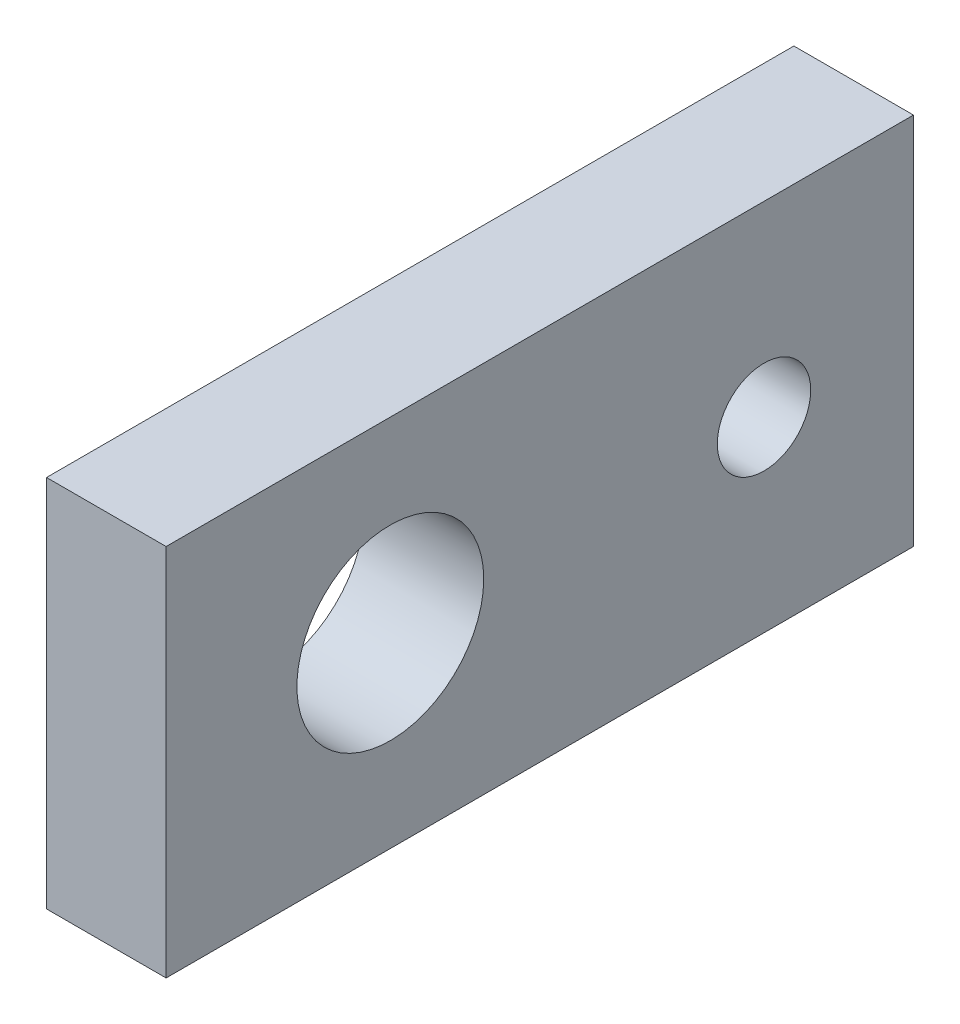
ISO-10303-21;
HEADER;
FILE_DESCRIPTION(('STEP AP214'),'2;1');
FILE_NAME('part.step','',(''),(''),'','','');
FILE_SCHEMA(('AUTOMOTIVE_DESIGN { 1 0 10303 214 1 1 1 1 }'));
ENDSEC;
DATA;
#1=APPLICATION_CONTEXT('core data for automotive mechanical design processes');
#2=APPLICATION_PROTOCOL_DEFINITION('international standard','automotive_design',2000,#1);
#3=PRODUCT_CONTEXT('',#1,'mechanical');
#4=PRODUCT('Part','Part','',(#3));
#5=PRODUCT_RELATED_PRODUCT_CATEGORY('part','',(#4));
#6=PRODUCT_DEFINITION_FORMATION('','',#4);
#7=PRODUCT_DEFINITION_CONTEXT('part definition',#1,'design');
#8=PRODUCT_DEFINITION('design','',#6,#7);
#9=PRODUCT_DEFINITION_SHAPE('','',#8);
#10=(LENGTH_UNIT() NAMED_UNIT(*) SI_UNIT(.MILLI.,.METRE.));
#11=(NAMED_UNIT(*) PLANE_ANGLE_UNIT() SI_UNIT($,.RADIAN.));
#12=(NAMED_UNIT(*) SI_UNIT($,.STERADIAN.) SOLID_ANGLE_UNIT());
#13=UNCERTAINTY_MEASURE_WITH_UNIT(LENGTH_MEASURE(1.E-05),#10,'distance_accuracy_value','');
#14=(GEOMETRIC_REPRESENTATION_CONTEXT(3) GLOBAL_UNCERTAINTY_ASSIGNED_CONTEXT((#13)) GLOBAL_UNIT_ASSIGNED_CONTEXT((#10,
#11,#12)) REPRESENTATION_CONTEXT('',''));
#15=CARTESIAN_POINT('',(0.,0.,0.));
#16=DIRECTION('',(0.,0.,1.));
#17=DIRECTION('',(1.,0.,0.));
#18=AXIS2_PLACEMENT_3D('',#15,#16,#17);
#19=CARTESIAN_POINT('',(2.032,0.,0.));
#20=DIRECTION('',(0.,0.,-1.));
#21=DIRECTION('',(-1.,0.,0.));
#22=AXIS2_PLACEMENT_3D('',#19,#20,#21);
#23=PLANE('',#22);
#24=DIRECTION('',(0.,-1.,0.));
#25=VECTOR('',#24,1.);
#26=CARTESIAN_POINT('',(0.,0.,0.));
#27=LINE('',#26,#25);
#28=CARTESIAN_POINT('',(0.,6.35,0.));
#29=VERTEX_POINT('',#28);
#30=CARTESIAN_POINT('',(0.,0.,0.));
#31=VERTEX_POINT('',#30);
#32=EDGE_CURVE('E97',#29,#31,#27,.T.);
#33=ORIENTED_EDGE('',*,*,#32,.T.);
#34=DIRECTION('',(-1.,0.,0.));
#35=VECTOR('',#34,1.);
#36=CARTESIAN_POINT('',(2.032,0.,0.));
#37=LINE('',#36,#35);
#38=CARTESIAN_POINT('',(2.032,0.,0.));
#39=VERTEX_POINT('',#38);
#40=EDGE_CURVE('E11',#39,#31,#37,.T.);
#41=ORIENTED_EDGE('',*,*,#40,.F.);
#42=DIRECTION('',(0.,-1.,0.));
#43=VECTOR('',#42,1.);
#44=CARTESIAN_POINT('',(2.032,0.,0.));
#45=LINE('',#44,#43);
#46=CARTESIAN_POINT('',(2.032,6.35,0.));
#47=VERTEX_POINT('',#46);
#48=EDGE_CURVE('E84',#47,#39,#45,.T.);
#49=ORIENTED_EDGE('',*,*,#48,.F.);
#50=DIRECTION('',(-1.,0.,0.));
#51=VECTOR('',#50,1.);
#52=CARTESIAN_POINT('',(2.032,6.35,0.));
#53=LINE('',#52,#51);
#54=EDGE_CURVE('E93',#47,#29,#53,.T.);
#55=ORIENTED_EDGE('',*,*,#54,.T.);
#56=EDGE_LOOP('',(#33,#41,#49,#55));
#57=FACE_BOUND('',#56,.T.);
#58=ADVANCED_FACE('F32',(#57),#23,.F.);
#59=CARTESIAN_POINT('',(2.032,0.,0.));
#60=DIRECTION('',(0.,1.,0.));
#61=DIRECTION('',(0.,0.,1.));
#62=AXIS2_PLACEMENT_3D('',#59,#60,#61);
#63=PLANE('',#62);
#64=DIRECTION('',(0.,0.,-1.));
#65=VECTOR('',#64,1.);
#66=CARTESIAN_POINT('',(0.,0.,0.));
#67=LINE('',#66,#65);
#68=CARTESIAN_POINT('',(0.,0.,-12.7));
#69=VERTEX_POINT('',#68);
#70=EDGE_CURVE('E88',#31,#69,#67,.T.);
#71=ORIENTED_EDGE('',*,*,#70,.T.);
#72=DIRECTION('',(-1.,0.,0.));
#73=VECTOR('',#72,1.);
#74=CARTESIAN_POINT('',(2.032,0.,-12.7));
#75=LINE('',#74,#73);
#76=CARTESIAN_POINT('',(2.032,0.,-12.7));
#77=VERTEX_POINT('',#76);
#78=EDGE_CURVE('E41',#77,#69,#75,.T.);
#79=ORIENTED_EDGE('',*,*,#78,.F.);
#80=DIRECTION('',(0.,0.,-1.));
#81=VECTOR('',#80,1.);
#82=CARTESIAN_POINT('',(2.032,0.,0.));
#83=LINE('',#82,#81);
#84=EDGE_CURVE('E79',#39,#77,#83,.T.);
#85=ORIENTED_EDGE('',*,*,#84,.F.);
#86=ORIENTED_EDGE('',*,*,#40,.T.);
#87=EDGE_LOOP('',(#71,#79,#85,#86));
#88=FACE_BOUND('',#87,.T.);
#89=ADVANCED_FACE('F87',(#88),#63,.F.);
#90=CARTESIAN_POINT('',(2.032,0.,-12.7));
#91=DIRECTION('',(0.,0.,1.));
#92=DIRECTION('',(1.,0.,0.));
#93=AXIS2_PLACEMENT_3D('',#90,#91,#92);
#94=PLANE('',#93);
#95=DIRECTION('',(0.,1.,0.));
#96=VECTOR('',#95,1.);
#97=CARTESIAN_POINT('',(0.,0.,-12.7));
#98=LINE('',#97,#96);
#99=CARTESIAN_POINT('',(0.,6.35,-12.7));
#100=VERTEX_POINT('',#99);
#101=EDGE_CURVE('E66',#69,#100,#98,.T.);
#102=ORIENTED_EDGE('',*,*,#101,.T.);
#103=DIRECTION('',(-1.,0.,0.));
#104=VECTOR('',#103,1.);
#105=CARTESIAN_POINT('',(2.032,6.35,-12.7));
#106=LINE('',#105,#104);
#107=CARTESIAN_POINT('',(2.032,6.35,-12.7));
#108=VERTEX_POINT('',#107);
#109=EDGE_CURVE('E89',#108,#100,#106,.T.);
#110=ORIENTED_EDGE('',*,*,#109,.F.);
#111=DIRECTION('',(0.,1.,0.));
#112=VECTOR('',#111,1.);
#113=CARTESIAN_POINT('',(2.032,0.,-12.7));
#114=LINE('',#113,#112);
#115=EDGE_CURVE('E82',#77,#108,#114,.T.);
#116=ORIENTED_EDGE('',*,*,#115,.F.);
#117=ORIENTED_EDGE('',*,*,#78,.T.);
#118=EDGE_LOOP('',(#102,#110,#116,#117));
#119=FACE_BOUND('',#118,.T.);
#120=ADVANCED_FACE('F91',(#119),#94,.F.);
#121=CARTESIAN_POINT('',(2.032,6.35,0.));
#122=DIRECTION('',(0.,-1.,0.));
#123=DIRECTION('',(0.,0.,-1.));
#124=AXIS2_PLACEMENT_3D('',#121,#122,#123);
#125=PLANE('',#124);
#126=DIRECTION('',(0.,0.,1.));
#127=VECTOR('',#126,1.);
#128=CARTESIAN_POINT('',(0.,6.35,0.));
#129=LINE('',#128,#127);
#130=EDGE_CURVE('E72',#100,#29,#129,.T.);
#131=ORIENTED_EDGE('',*,*,#130,.T.);
#132=ORIENTED_EDGE('',*,*,#54,.F.);
#133=DIRECTION('',(0.,0.,1.));
#134=VECTOR('',#133,1.);
#135=CARTESIAN_POINT('',(2.032,6.35,0.));
#136=LINE('',#135,#134);
#137=EDGE_CURVE('E49',#108,#47,#136,.T.);
#138=ORIENTED_EDGE('',*,*,#137,.F.);
#139=ORIENTED_EDGE('',*,*,#109,.T.);
#140=EDGE_LOOP('',(#131,#132,#138,#139));
#141=FACE_BOUND('',#140,.T.);
#142=ADVANCED_FACE('F105',(#141),#125,.F.);
#143=CARTESIAN_POINT('',(2.032,0.,0.));
#144=DIRECTION('',(-1.,0.,0.));
#145=DIRECTION('',(0.,0.,1.));
#146=AXIS2_PLACEMENT_3D('',#143,#144,#145);
#147=PLANE('',#146);
#148=CARTESIAN_POINT('',(2.032,3.175,-3.81));
#149=DIRECTION('',(1.,0.,0.));
#150=DIRECTION('',(0.,0.,-1.));
#151=AXIS2_PLACEMENT_3D('',#148,#149,#150);
#152=CIRCLE('',#151,1.58749999999999);
#153=CARTESIAN_POINT('',(2.032,3.175,-5.39749999999999));
#154=VERTEX_POINT('',#153);
#155=EDGE_CURVE('E116',#154,#154,#152,.T.);
#156=ORIENTED_EDGE('',*,*,#155,.F.);
#157=EDGE_LOOP('',(#156));
#158=FACE_BOUND('',#157,.T.);
#159=CARTESIAN_POINT('',(2.032,3.175,-10.16));
#160=DIRECTION('',(1.,0.,0.));
#161=DIRECTION('',(0.,0.,-1.));
#162=AXIS2_PLACEMENT_3D('',#159,#160,#161);
#163=CIRCLE('',#162,0.793749999999989);
#164=CARTESIAN_POINT('',(2.032,3.175,-10.95375));
#165=VERTEX_POINT('',#164);
#166=EDGE_CURVE('E113',#165,#165,#163,.T.);
#167=ORIENTED_EDGE('',*,*,#166,.F.);
#168=EDGE_LOOP('',(#167));
#169=FACE_BOUND('',#168,.T.);
#170=ORIENTED_EDGE('',*,*,#48,.T.);
#171=ORIENTED_EDGE('',*,*,#84,.T.);
#172=ORIENTED_EDGE('',*,*,#115,.T.);
#173=ORIENTED_EDGE('',*,*,#137,.T.);
#174=EDGE_LOOP('',(#170,#171,#172,#173));
#175=FACE_BOUND('',#174,.T.);
#176=ADVANCED_FACE('F80',(#158,#169,#175),#147,.F.);
#177=CARTESIAN_POINT('',(0.,0.,0.));
#178=DIRECTION('',(-1.,0.,0.));
#179=DIRECTION('',(0.,0.,1.));
#180=AXIS2_PLACEMENT_3D('',#177,#178,#179);
#181=PLANE('',#180);
#182=CARTESIAN_POINT('',(0.,3.175,-3.81));
#183=DIRECTION('',(-1.,0.,0.));
#184=DIRECTION('',(0.,0.,1.));
#185=AXIS2_PLACEMENT_3D('',#182,#183,#184);
#186=CIRCLE('',#185,1.58749999999999);
#187=CARTESIAN_POINT('',(0.,3.175,-2.22250000000001));
#188=VERTEX_POINT('',#187);
#189=EDGE_CURVE('E35',#188,#188,#186,.T.);
#190=ORIENTED_EDGE('',*,*,#189,.F.);
#191=EDGE_LOOP('',(#190));
#192=FACE_BOUND('',#191,.T.);
#193=CARTESIAN_POINT('',(0.,3.175,-10.16));
#194=DIRECTION('',(-1.,0.,0.));
#195=DIRECTION('',(0.,0.,1.));
#196=AXIS2_PLACEMENT_3D('',#193,#194,#195);
#197=CIRCLE('',#196,0.793749999999985);
#198=CARTESIAN_POINT('',(0.,3.175,-9.36625000000001));
#199=VERTEX_POINT('',#198);
#200=EDGE_CURVE('E100',#199,#199,#197,.T.);
#201=ORIENTED_EDGE('',*,*,#200,.F.);
#202=EDGE_LOOP('',(#201));
#203=FACE_BOUND('',#202,.T.);
#204=ORIENTED_EDGE('',*,*,#32,.F.);
#205=ORIENTED_EDGE('',*,*,#130,.F.);
#206=ORIENTED_EDGE('',*,*,#101,.F.);
#207=ORIENTED_EDGE('',*,*,#70,.F.);
#208=EDGE_LOOP('',(#204,#205,#206,#207));
#209=FACE_BOUND('',#208,.T.);
#210=ADVANCED_FACE('F108',(#192,#203,#209),#181,.T.);
#211=CARTESIAN_POINT('',(2.032,3.175,-10.16));
#212=DIRECTION('',(1.,0.,0.));
#213=DIRECTION('',(0.,0.,-1.));
#214=AXIS2_PLACEMENT_3D('',#211,#212,#213);
#215=CYLINDRICAL_SURFACE('',#214,0.793749999999985);
#216=ORIENTED_EDGE('',*,*,#200,.T.);
#217=EDGE_LOOP('',(#216));
#218=FACE_BOUND('',#217,.T.);
#219=ORIENTED_EDGE('',*,*,#166,.T.);
#220=EDGE_LOOP('',(#219));
#221=FACE_BOUND('',#220,.T.);
#222=ADVANCED_FACE('F127',(#218,#221),#215,.F.);
#223=CARTESIAN_POINT('',(2.032,3.175,-3.81));
#224=DIRECTION('',(1.,0.,0.));
#225=DIRECTION('',(0.,0.,-1.));
#226=AXIS2_PLACEMENT_3D('',#223,#224,#225);
#227=CYLINDRICAL_SURFACE('',#226,1.58749999999999);
#228=ORIENTED_EDGE('',*,*,#189,.T.);
#229=EDGE_LOOP('',(#228));
#230=FACE_BOUND('',#229,.T.);
#231=ORIENTED_EDGE('',*,*,#155,.T.);
#232=EDGE_LOOP('',(#231));
#233=FACE_BOUND('',#232,.T.);
#234=ADVANCED_FACE('F123',(#230,#233),#227,.F.);
#235=CLOSED_SHELL('',(#58,#89,#120,#142,#176,#210,#222,#234));
#236=MANIFOLD_SOLID_BREP('B2',#235);
#237=ADVANCED_BREP_SHAPE_REPRESENTATION('',(#18,#236),#14);
#238=SHAPE_DEFINITION_REPRESENTATION(#9,#237);
ENDSEC;
END-ISO-10303-21;
